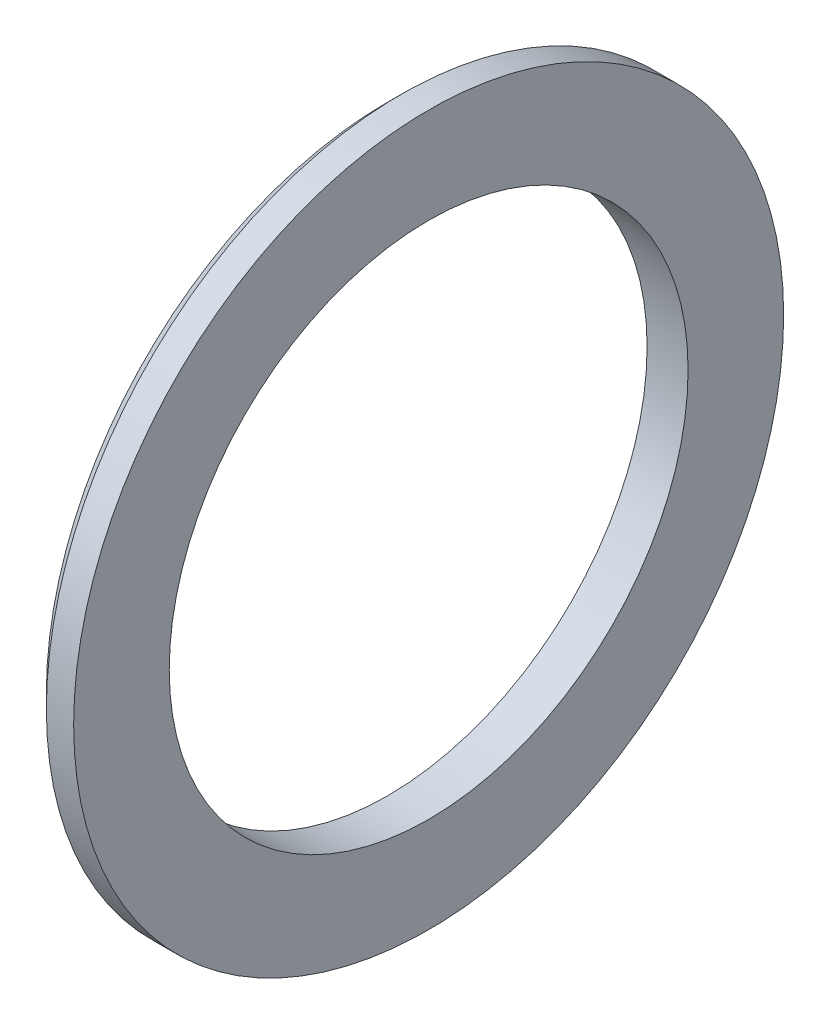
ISO-10303-21;
HEADER;
FILE_DESCRIPTION(('STEP AP214'),'2;1');
FILE_NAME('part.step','',(''),(''),'','','');
FILE_SCHEMA(('AUTOMOTIVE_DESIGN { 1 0 10303 214 1 1 1 1 }'));
ENDSEC;
DATA;
#1=APPLICATION_CONTEXT('core data for automotive mechanical design processes');
#2=APPLICATION_PROTOCOL_DEFINITION('international standard','automotive_design',2000,#1);
#3=PRODUCT_CONTEXT('',#1,'mechanical');
#4=PRODUCT('Part','Part','',(#3));
#5=PRODUCT_RELATED_PRODUCT_CATEGORY('part','',(#4));
#6=PRODUCT_DEFINITION_FORMATION('','',#4);
#7=PRODUCT_DEFINITION_CONTEXT('part definition',#1,'design');
#8=PRODUCT_DEFINITION('design','',#6,#7);
#9=PRODUCT_DEFINITION_SHAPE('','',#8);
#10=(LENGTH_UNIT() NAMED_UNIT(*) SI_UNIT(.MILLI.,.METRE.));
#11=(NAMED_UNIT(*) PLANE_ANGLE_UNIT() SI_UNIT($,.RADIAN.));
#12=(NAMED_UNIT(*) SI_UNIT($,.STERADIAN.) SOLID_ANGLE_UNIT());
#13=UNCERTAINTY_MEASURE_WITH_UNIT(LENGTH_MEASURE(1.E-05),#10,'distance_accuracy_value','');
#14=(GEOMETRIC_REPRESENTATION_CONTEXT(3) GLOBAL_UNCERTAINTY_ASSIGNED_CONTEXT((#13)) GLOBAL_UNIT_ASSIGNED_CONTEXT((#10,
#11,#12)) REPRESENTATION_CONTEXT('',''));
#15=CARTESIAN_POINT('',(0.,0.,0.));
#16=DIRECTION('',(0.,0.,1.));
#17=DIRECTION('',(1.,0.,0.));
#18=AXIS2_PLACEMENT_3D('',#15,#16,#17);
#19=CARTESIAN_POINT('',(0.,0.,0.));
#20=DIRECTION('',(-1.,0.,0.));
#21=DIRECTION('',(0.,0.,1.));
#22=AXIS2_PLACEMENT_3D('',#19,#20,#21);
#23=CYLINDRICAL_SURFACE('',#22,19.);
#24=CARTESIAN_POINT('',(3.,0.,0.));
#25=DIRECTION('',(-1.,0.,0.));
#26=DIRECTION('',(0.,0.,1.));
#27=AXIS2_PLACEMENT_3D('',#24,#25,#26);
#28=CIRCLE('',#27,19.);
#29=CARTESIAN_POINT('',(3.,0.,19.));
#30=VERTEX_POINT('',#29);
#31=EDGE_CURVE('E54',#30,#30,#28,.T.);
#32=ORIENTED_EDGE('',*,*,#31,.F.);
#33=EDGE_LOOP('',(#32));
#34=FACE_BOUND('',#33,.T.);
#35=CARTESIAN_POINT('',(0.,0.,0.));
#36=DIRECTION('',(-1.,0.,0.));
#37=DIRECTION('',(0.,0.,1.));
#38=AXIS2_PLACEMENT_3D('',#35,#36,#37);
#39=CIRCLE('',#38,19.);
#40=CARTESIAN_POINT('',(0.,0.,19.));
#41=VERTEX_POINT('',#40);
#42=EDGE_CURVE('E10',#41,#41,#39,.T.);
#43=ORIENTED_EDGE('',*,*,#42,.T.);
#44=EDGE_LOOP('',(#43));
#45=FACE_BOUND('',#44,.T.);
#46=ADVANCED_FACE('F35',(#34,#45),#23,.F.);
#47=CARTESIAN_POINT('',(0.,19.,0.));
#48=DIRECTION('',(1.,0.,0.));
#49=DIRECTION('',(0.,0.,-1.));
#50=AXIS2_PLACEMENT_3D('',#47,#48,#49);
#51=PLANE('',#50);
#52=ORIENTED_EDGE('',*,*,#42,.F.);
#53=EDGE_LOOP('',(#52));
#54=FACE_BOUND('',#53,.T.);
#55=CARTESIAN_POINT('',(0.,0.,0.));
#56=DIRECTION('',(-1.,0.,0.));
#57=DIRECTION('',(0.,0.,1.));
#58=AXIS2_PLACEMENT_3D('',#55,#56,#57);
#59=CIRCLE('',#58,25.);
#60=CARTESIAN_POINT('',(0.,0.,25.));
#61=VERTEX_POINT('',#60);
#62=EDGE_CURVE('E41',#61,#61,#59,.T.);
#63=ORIENTED_EDGE('',*,*,#62,.T.);
#64=EDGE_LOOP('',(#63));
#65=FACE_BOUND('',#64,.T.);
#66=ADVANCED_FACE('F61',(#54,#65),#51,.F.);
#67=CARTESIAN_POINT('',(1.,0.,0.));
#68=DIRECTION('',(1.,0.,0.));
#69=DIRECTION('',(0.,0.,-1.));
#70=AXIS2_PLACEMENT_3D('',#67,#68,#69);
#71=CONICAL_SURFACE('',#70,26.,0.785398163397447);
#72=ORIENTED_EDGE('',*,*,#62,.F.);
#73=EDGE_LOOP('',(#72));
#74=FACE_BOUND('',#73,.T.);
#75=CARTESIAN_POINT('',(1.,0.,0.));
#76=DIRECTION('',(-1.,0.,0.));
#77=DIRECTION('',(0.,0.,1.));
#78=AXIS2_PLACEMENT_3D('',#75,#76,#77);
#79=CIRCLE('',#78,26.);
#80=CARTESIAN_POINT('',(1.,0.,26.));
#81=VERTEX_POINT('',#80);
#82=EDGE_CURVE('E45',#81,#81,#79,.T.);
#83=ORIENTED_EDGE('',*,*,#82,.T.);
#84=EDGE_LOOP('',(#83));
#85=FACE_BOUND('',#84,.T.);
#86=ADVANCED_FACE('F65',(#74,#85),#71,.T.);
#87=CARTESIAN_POINT('',(0.,0.,0.));
#88=DIRECTION('',(-1.,0.,0.));
#89=DIRECTION('',(0.,0.,1.));
#90=AXIS2_PLACEMENT_3D('',#87,#88,#89);
#91=CYLINDRICAL_SURFACE('',#90,26.);
#92=ORIENTED_EDGE('',*,*,#82,.F.);
#93=EDGE_LOOP('',(#92));
#94=FACE_BOUND('',#93,.T.);
#95=CARTESIAN_POINT('',(3.,0.,0.));
#96=DIRECTION('',(-1.,0.,0.));
#97=DIRECTION('',(0.,0.,1.));
#98=AXIS2_PLACEMENT_3D('',#95,#96,#97);
#99=CIRCLE('',#98,26.);
#100=CARTESIAN_POINT('',(3.,0.,26.));
#101=VERTEX_POINT('',#100);
#102=EDGE_CURVE('E49',#101,#101,#99,.T.);
#103=ORIENTED_EDGE('',*,*,#102,.T.);
#104=EDGE_LOOP('',(#103));
#105=FACE_BOUND('',#104,.T.);
#106=ADVANCED_FACE('F70',(#94,#105),#91,.T.);
#107=CARTESIAN_POINT('',(3.,26.,0.));
#108=DIRECTION('',(-1.,0.,0.));
#109=DIRECTION('',(0.,0.,1.));
#110=AXIS2_PLACEMENT_3D('',#107,#108,#109);
#111=PLANE('',#110);
#112=ORIENTED_EDGE('',*,*,#102,.F.);
#113=EDGE_LOOP('',(#112));
#114=FACE_BOUND('',#113,.T.);
#115=ORIENTED_EDGE('',*,*,#31,.T.);
#116=EDGE_LOOP('',(#115));
#117=FACE_BOUND('',#116,.T.);
#118=ADVANCED_FACE('F58',(#114,#117),#111,.F.);
#119=CLOSED_SHELL('',(#46,#66,#86,#106,#118));
#120=MANIFOLD_SOLID_BREP('B2',#119);
#121=ADVANCED_BREP_SHAPE_REPRESENTATION('',(#18,#120),#14);
#122=SHAPE_DEFINITION_REPRESENTATION(#9,#121);
ENDSEC;
END-ISO-10303-21;
